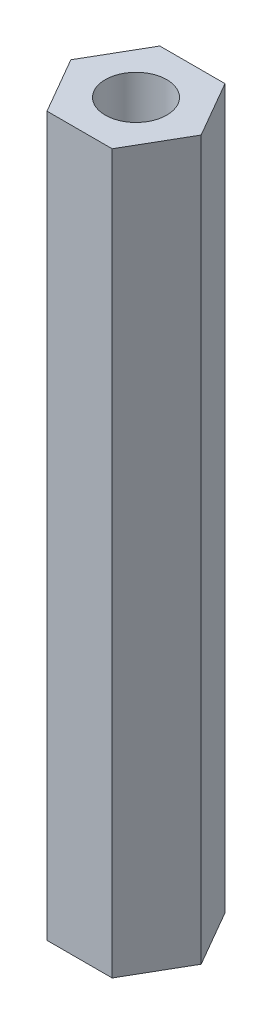
ISO-10303-21;
HEADER;
FILE_DESCRIPTION(('STEP AP214'),'2;1');
FILE_NAME('part.step','',(''),(''),'','','');
FILE_SCHEMA(('AUTOMOTIVE_DESIGN { 1 0 10303 214 1 1 1 1 }'));
ENDSEC;
DATA;
#1=APPLICATION_CONTEXT('core data for automotive mechanical design processes');
#2=APPLICATION_PROTOCOL_DEFINITION('international standard','automotive_design',2000,#1);
#3=PRODUCT_CONTEXT('',#1,'mechanical');
#4=PRODUCT('Part','Part','',(#3));
#5=PRODUCT_RELATED_PRODUCT_CATEGORY('part','',(#4));
#6=PRODUCT_DEFINITION_FORMATION('','',#4);
#7=PRODUCT_DEFINITION_CONTEXT('part definition',#1,'design');
#8=PRODUCT_DEFINITION('design','',#6,#7);
#9=PRODUCT_DEFINITION_SHAPE('','',#8);
#10=(LENGTH_UNIT() NAMED_UNIT(*) SI_UNIT(.MILLI.,.METRE.));
#11=(NAMED_UNIT(*) PLANE_ANGLE_UNIT() SI_UNIT($,.RADIAN.));
#12=(NAMED_UNIT(*) SI_UNIT($,.STERADIAN.) SOLID_ANGLE_UNIT());
#13=UNCERTAINTY_MEASURE_WITH_UNIT(LENGTH_MEASURE(1.E-05),#10,'distance_accuracy_value','');
#14=(GEOMETRIC_REPRESENTATION_CONTEXT(3) GLOBAL_UNCERTAINTY_ASSIGNED_CONTEXT((#13)) GLOBAL_UNIT_ASSIGNED_CONTEXT((#10,
#11,#12)) REPRESENTATION_CONTEXT('',''));
#15=CARTESIAN_POINT('',(0.,0.,0.));
#16=DIRECTION('',(0.,0.,1.));
#17=DIRECTION('',(1.,0.,0.));
#18=AXIS2_PLACEMENT_3D('',#15,#16,#17);
#19=CARTESIAN_POINT('',(0.,35.,0.));
#20=DIRECTION('',(0.,1.,0.));
#21=DIRECTION('',(0.,0.,1.));
#22=AXIS2_PLACEMENT_3D('',#19,#20,#21);
#23=PLANE('',#22);
#24=DIRECTION('',(0.5,0.,-0.866025403784439));
#25=VECTOR('',#24,1.);
#26=CARTESIAN_POINT('',(1.58771324027147,35.,2.75));
#27=LINE('',#26,#25);
#28=CARTESIAN_POINT('',(1.58771324027147,35.,2.75));
#29=VERTEX_POINT('',#28);
#30=CARTESIAN_POINT('',(3.17542648054294,35.,0.));
#31=VERTEX_POINT('',#30);
#32=EDGE_CURVE('E129',#29,#31,#27,.T.);
#33=ORIENTED_EDGE('',*,*,#32,.T.);
#34=DIRECTION('',(-0.5,0.,-0.866025403784439));
#35=VECTOR('',#34,1.);
#36=CARTESIAN_POINT('',(3.17542648054294,35.,0.));
#37=LINE('',#36,#35);
#38=CARTESIAN_POINT('',(1.58771324027147,35.,-2.75));
#39=VERTEX_POINT('',#38);
#40=EDGE_CURVE('E87',#31,#39,#37,.T.);
#41=ORIENTED_EDGE('',*,*,#40,.T.);
#42=DIRECTION('',(-1.,0.,0.));
#43=VECTOR('',#42,1.);
#44=CARTESIAN_POINT('',(1.58771324027147,35.,-2.75));
#45=LINE('',#44,#43);
#46=CARTESIAN_POINT('',(-1.58771324027147,35.,-2.75));
#47=VERTEX_POINT('',#46);
#48=EDGE_CURVE('E100',#39,#47,#45,.T.);
#49=ORIENTED_EDGE('',*,*,#48,.T.);
#50=DIRECTION('',(-0.5,0.,0.866025403784439));
#51=VECTOR('',#50,1.);
#52=CARTESIAN_POINT('',(-1.58771324027147,35.,-2.75));
#53=LINE('',#52,#51);
#54=CARTESIAN_POINT('',(-3.17542648054294,35.,0.));
#55=VERTEX_POINT('',#54);
#56=EDGE_CURVE('E94',#47,#55,#53,.T.);
#57=ORIENTED_EDGE('',*,*,#56,.T.);
#58=DIRECTION('',(0.5,0.,0.866025403784439));
#59=VECTOR('',#58,1.);
#60=CARTESIAN_POINT('',(-3.17542648054294,35.,0.));
#61=LINE('',#60,#59);
#62=CARTESIAN_POINT('',(-1.58771324027147,35.,2.75));
#63=VERTEX_POINT('',#62);
#64=EDGE_CURVE('E98',#55,#63,#61,.T.);
#65=ORIENTED_EDGE('',*,*,#64,.T.);
#66=DIRECTION('',(1.,0.,0.));
#67=VECTOR('',#66,1.);
#68=CARTESIAN_POINT('',(-1.58771324027147,35.,2.75));
#69=LINE('',#68,#67);
#70=EDGE_CURVE('E50',#63,#29,#69,.T.);
#71=ORIENTED_EDGE('',*,*,#70,.T.);
#72=EDGE_LOOP('',(#33,#41,#49,#57,#65,#71));
#73=FACE_BOUND('',#72,.T.);
#74=CARTESIAN_POINT('',(0.,35.,0.));
#75=DIRECTION('',(0.,1.,0.));
#76=DIRECTION('',(0.,0.,1.));
#77=AXIS2_PLACEMENT_3D('',#74,#75,#76);
#78=CIRCLE('',#77,1.5);
#79=CARTESIAN_POINT('',(0.,35.,1.5));
#80=VERTEX_POINT('',#79);
#81=EDGE_CURVE('E122',#80,#80,#78,.T.);
#82=ORIENTED_EDGE('',*,*,#81,.F.);
#83=EDGE_LOOP('',(#82));
#84=FACE_BOUND('',#83,.T.);
#85=ADVANCED_FACE('F33',(#73,#84),#23,.T.);
#86=CARTESIAN_POINT('',(0.,0.,0.));
#87=DIRECTION('',(0.,1.,0.));
#88=DIRECTION('',(0.,0.,1.));
#89=AXIS2_PLACEMENT_3D('',#86,#87,#88);
#90=PLANE('',#89);
#91=DIRECTION('',(0.5,0.,-0.866025403784439));
#92=VECTOR('',#91,1.);
#93=CARTESIAN_POINT('',(1.58771324027147,0.,2.75));
#94=LINE('',#93,#92);
#95=CARTESIAN_POINT('',(1.58771324027147,0.,2.75));
#96=VERTEX_POINT('',#95);
#97=CARTESIAN_POINT('',(3.17542648054294,0.,0.));
#98=VERTEX_POINT('',#97);
#99=EDGE_CURVE('E118',#96,#98,#94,.T.);
#100=ORIENTED_EDGE('',*,*,#99,.F.);
#101=DIRECTION('',(1.,0.,0.));
#102=VECTOR('',#101,1.);
#103=CARTESIAN_POINT('',(-1.58771324027147,0.,2.75));
#104=LINE('',#103,#102);
#105=CARTESIAN_POINT('',(-1.58771324027147,0.,2.75));
#106=VERTEX_POINT('',#105);
#107=EDGE_CURVE('E79',#106,#96,#104,.T.);
#108=ORIENTED_EDGE('',*,*,#107,.F.);
#109=DIRECTION('',(0.5,0.,0.866025403784439));
#110=VECTOR('',#109,1.);
#111=CARTESIAN_POINT('',(-3.17542648054294,0.,0.));
#112=LINE('',#111,#110);
#113=CARTESIAN_POINT('',(-3.17542648054294,0.,0.));
#114=VERTEX_POINT('',#113);
#115=EDGE_CURVE('E73',#114,#106,#112,.T.);
#116=ORIENTED_EDGE('',*,*,#115,.F.);
#117=DIRECTION('',(-0.5,0.,0.866025403784439));
#118=VECTOR('',#117,1.);
#119=CARTESIAN_POINT('',(-1.58771324027147,0.,-2.75));
#120=LINE('',#119,#118);
#121=CARTESIAN_POINT('',(-1.58771324027147,0.,-2.75));
#122=VERTEX_POINT('',#121);
#123=EDGE_CURVE('E108',#122,#114,#120,.T.);
#124=ORIENTED_EDGE('',*,*,#123,.F.);
#125=DIRECTION('',(-1.,0.,0.));
#126=VECTOR('',#125,1.);
#127=CARTESIAN_POINT('',(1.58771324027147,0.,-2.75));
#128=LINE('',#127,#126);
#129=CARTESIAN_POINT('',(1.58771324027147,0.,-2.75));
#130=VERTEX_POINT('',#129);
#131=EDGE_CURVE('E124',#130,#122,#128,.T.);
#132=ORIENTED_EDGE('',*,*,#131,.F.);
#133=DIRECTION('',(-0.5,0.,-0.866025403784439));
#134=VECTOR('',#133,1.);
#135=CARTESIAN_POINT('',(3.17542648054294,0.,0.));
#136=LINE('',#135,#134);
#137=EDGE_CURVE('E121',#98,#130,#136,.T.);
#138=ORIENTED_EDGE('',*,*,#137,.F.);
#139=EDGE_LOOP('',(#100,#108,#116,#124,#132,#138));
#140=FACE_BOUND('',#139,.T.);
#141=CARTESIAN_POINT('',(0.,0.,0.));
#142=DIRECTION('',(0.,1.,0.));
#143=DIRECTION('',(0.,0.,1.));
#144=AXIS2_PLACEMENT_3D('',#141,#142,#143);
#145=CIRCLE('',#144,1.5);
#146=CARTESIAN_POINT('',(0.,0.,1.5));
#147=VERTEX_POINT('',#146);
#148=EDGE_CURVE('E222',#147,#147,#145,.T.);
#149=ORIENTED_EDGE('',*,*,#148,.T.);
#150=EDGE_LOOP('',(#149));
#151=FACE_BOUND('',#150,.T.);
#152=ADVANCED_FACE('F138',(#140,#151),#90,.F.);
#153=CARTESIAN_POINT('',(1.58771324027147,35.,2.75));
#154=DIRECTION('',(-0.866025403784439,0.,-0.5));
#155=DIRECTION('',(-0.5,0.,0.866025403784439));
#156=AXIS2_PLACEMENT_3D('',#153,#154,#155);
#157=PLANE('',#156);
#158=ORIENTED_EDGE('',*,*,#99,.T.);
#159=DIRECTION('',(0.,-1.,0.));
#160=VECTOR('',#159,1.);
#161=CARTESIAN_POINT('',(3.17542648054294,35.,0.));
#162=LINE('',#161,#160);
#163=EDGE_CURVE('E11',#31,#98,#162,.T.);
#164=ORIENTED_EDGE('',*,*,#163,.F.);
#165=ORIENTED_EDGE('',*,*,#32,.F.);
#166=DIRECTION('',(0.,-1.,0.));
#167=VECTOR('',#166,1.);
#168=CARTESIAN_POINT('',(1.58771324027147,35.,2.75));
#169=LINE('',#168,#167);
#170=EDGE_CURVE('E114',#29,#96,#169,.T.);
#171=ORIENTED_EDGE('',*,*,#170,.T.);
#172=EDGE_LOOP('',(#158,#164,#165,#171));
#173=FACE_BOUND('',#172,.T.);
#174=ADVANCED_FACE('F35',(#173),#157,.F.);
#175=CARTESIAN_POINT('',(3.17542648054294,35.,0.));
#176=DIRECTION('',(-0.866025403784439,0.,0.5));
#177=DIRECTION('',(0.5,0.,0.866025403784439));
#178=AXIS2_PLACEMENT_3D('',#175,#176,#177);
#179=PLANE('',#178);
#180=ORIENTED_EDGE('',*,*,#137,.T.);
#181=DIRECTION('',(0.,-1.,0.));
#182=VECTOR('',#181,1.);
#183=CARTESIAN_POINT('',(1.58771324027147,35.,-2.75));
#184=LINE('',#183,#182);
#185=EDGE_CURVE('E42',#39,#130,#184,.T.);
#186=ORIENTED_EDGE('',*,*,#185,.F.);
#187=ORIENTED_EDGE('',*,*,#40,.F.);
#188=ORIENTED_EDGE('',*,*,#163,.T.);
#189=EDGE_LOOP('',(#180,#186,#187,#188));
#190=FACE_BOUND('',#189,.T.);
#191=ADVANCED_FACE('F163',(#190),#179,.F.);
#192=CARTESIAN_POINT('',(1.58771324027147,35.,-2.75));
#193=DIRECTION('',(0.,0.,1.));
#194=DIRECTION('',(1.,0.,0.));
#195=AXIS2_PLACEMENT_3D('',#192,#193,#194);
#196=PLANE('',#195);
#197=ORIENTED_EDGE('',*,*,#131,.T.);
#198=DIRECTION('',(0.,-1.,0.));
#199=VECTOR('',#198,1.);
#200=CARTESIAN_POINT('',(-1.58771324027147,35.,-2.75));
#201=LINE('',#200,#199);
#202=EDGE_CURVE('E109',#47,#122,#201,.T.);
#203=ORIENTED_EDGE('',*,*,#202,.F.);
#204=ORIENTED_EDGE('',*,*,#48,.F.);
#205=ORIENTED_EDGE('',*,*,#185,.T.);
#206=EDGE_LOOP('',(#197,#203,#204,#205));
#207=FACE_BOUND('',#206,.T.);
#208=ADVANCED_FACE('F135',(#207),#196,.F.);
#209=CARTESIAN_POINT('',(-1.58771324027147,35.,-2.75));
#210=DIRECTION('',(0.866025403784439,0.,0.5));
#211=DIRECTION('',(0.5,0.,-0.866025403784439));
#212=AXIS2_PLACEMENT_3D('',#209,#210,#211);
#213=PLANE('',#212);
#214=ORIENTED_EDGE('',*,*,#123,.T.);
#215=DIRECTION('',(0.,-1.,0.));
#216=VECTOR('',#215,1.);
#217=CARTESIAN_POINT('',(-3.17542648054294,35.,0.));
#218=LINE('',#217,#216);
#219=EDGE_CURVE('E105',#55,#114,#218,.T.);
#220=ORIENTED_EDGE('',*,*,#219,.F.);
#221=ORIENTED_EDGE('',*,*,#56,.F.);
#222=ORIENTED_EDGE('',*,*,#202,.T.);
#223=EDGE_LOOP('',(#214,#220,#221,#222));
#224=FACE_BOUND('',#223,.T.);
#225=ADVANCED_FACE('F106',(#224),#213,.F.);
#226=CARTESIAN_POINT('',(-3.17542648054294,35.,0.));
#227=DIRECTION('',(0.866025403784439,0.,-0.5));
#228=DIRECTION('',(-0.5,0.,-0.866025403784439));
#229=AXIS2_PLACEMENT_3D('',#226,#227,#228);
#230=PLANE('',#229);
#231=ORIENTED_EDGE('',*,*,#115,.T.);
#232=DIRECTION('',(0.,-1.,0.));
#233=VECTOR('',#232,1.);
#234=CARTESIAN_POINT('',(-1.58771324027147,35.,2.75));
#235=LINE('',#234,#233);
#236=EDGE_CURVE('E110',#63,#106,#235,.T.);
#237=ORIENTED_EDGE('',*,*,#236,.F.);
#238=ORIENTED_EDGE('',*,*,#64,.F.);
#239=ORIENTED_EDGE('',*,*,#219,.T.);
#240=EDGE_LOOP('',(#231,#237,#238,#239));
#241=FACE_BOUND('',#240,.T.);
#242=ADVANCED_FACE('F112',(#241),#230,.F.);
#243=CARTESIAN_POINT('',(-1.58771324027147,35.,2.75));
#244=DIRECTION('',(0.,0.,-1.));
#245=DIRECTION('',(-1.,0.,0.));
#246=AXIS2_PLACEMENT_3D('',#243,#244,#245);
#247=PLANE('',#246);
#248=ORIENTED_EDGE('',*,*,#107,.T.);
#249=ORIENTED_EDGE('',*,*,#170,.F.);
#250=ORIENTED_EDGE('',*,*,#70,.F.);
#251=ORIENTED_EDGE('',*,*,#236,.T.);
#252=EDGE_LOOP('',(#248,#249,#250,#251));
#253=FACE_BOUND('',#252,.T.);
#254=ADVANCED_FACE('F143',(#253),#247,.F.);
#255=CARTESIAN_POINT('',(0.,35.,0.));
#256=DIRECTION('',(0.,-1.,0.));
#257=DIRECTION('',(0.,0.,-1.));
#258=AXIS2_PLACEMENT_3D('',#255,#256,#257);
#259=CYLINDRICAL_SURFACE('',#258,1.5);
#260=ORIENTED_EDGE('',*,*,#81,.T.);
#261=EDGE_LOOP('',(#260));
#262=FACE_BOUND('',#261,.T.);
#263=ORIENTED_EDGE('',*,*,#148,.F.);
#264=EDGE_LOOP('',(#263));
#265=FACE_BOUND('',#264,.T.);
#266=ADVANCED_FACE('F145',(#262,#265),#259,.F.);
#267=CLOSED_SHELL('',(#85,#152,#174,#191,#208,#225,#242,#254,#266));
#268=MANIFOLD_SOLID_BREP('B2',#267);
#269=ADVANCED_BREP_SHAPE_REPRESENTATION('',(#18,#268),#14);
#270=SHAPE_DEFINITION_REPRESENTATION(#9,#269);
ENDSEC;
END-ISO-10303-21;
